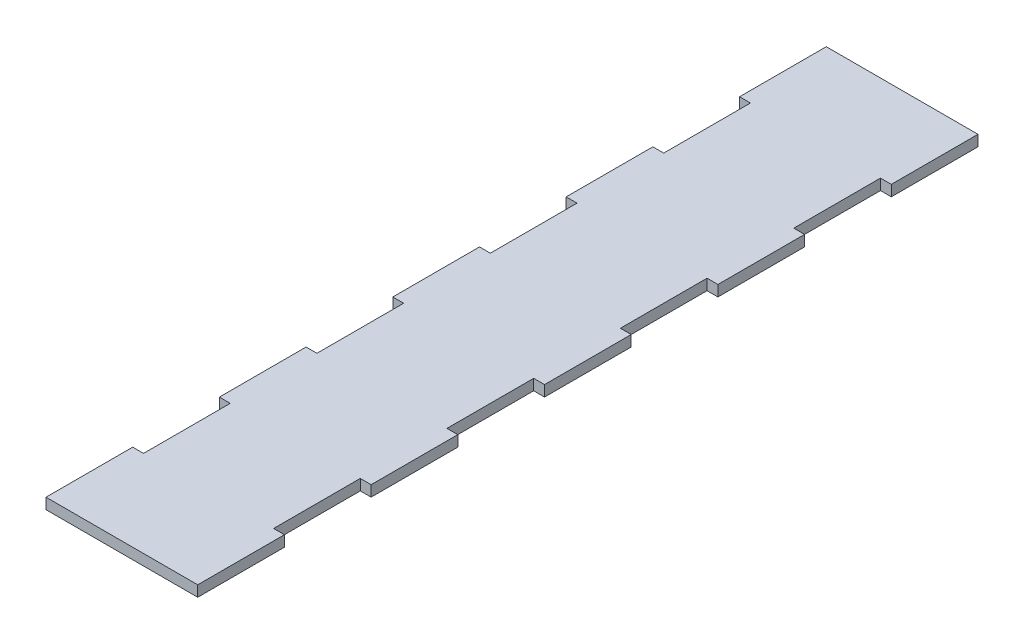
ISO-10303-21;
HEADER;
FILE_DESCRIPTION(('STEP AP214'),'2;1');
FILE_NAME('part.step','',(''),(''),'','','');
FILE_SCHEMA(('AUTOMOTIVE_DESIGN { 1 0 10303 214 1 1 1 1 }'));
ENDSEC;
DATA;
#1=APPLICATION_CONTEXT('core data for automotive mechanical design processes');
#2=APPLICATION_PROTOCOL_DEFINITION('international standard','automotive_design',2000,#1);
#3=PRODUCT_CONTEXT('',#1,'mechanical');
#4=PRODUCT('Part','Part','',(#3));
#5=PRODUCT_RELATED_PRODUCT_CATEGORY('part','',(#4));
#6=PRODUCT_DEFINITION_FORMATION('','',#4);
#7=PRODUCT_DEFINITION_CONTEXT('part definition',#1,'design');
#8=PRODUCT_DEFINITION('design','',#6,#7);
#9=PRODUCT_DEFINITION_SHAPE('','',#8);
#10=(LENGTH_UNIT() NAMED_UNIT(*) SI_UNIT(.MILLI.,.METRE.));
#11=(NAMED_UNIT(*) PLANE_ANGLE_UNIT() SI_UNIT($,.RADIAN.));
#12=(NAMED_UNIT(*) SI_UNIT($,.STERADIAN.) SOLID_ANGLE_UNIT());
#13=UNCERTAINTY_MEASURE_WITH_UNIT(LENGTH_MEASURE(1.E-05),#10,'distance_accuracy_value','');
#14=(GEOMETRIC_REPRESENTATION_CONTEXT(3) GLOBAL_UNCERTAINTY_ASSIGNED_CONTEXT((#13)) GLOBAL_UNIT_ASSIGNED_CONTEXT((#10,
#11,#12)) REPRESENTATION_CONTEXT('',''));
#15=CARTESIAN_POINT('',(0.,0.,0.));
#16=DIRECTION('',(0.,0.,1.));
#17=DIRECTION('',(1.,0.,0.));
#18=AXIS2_PLACEMENT_3D('',#15,#16,#17);
#19=CARTESIAN_POINT('',(38.1,0.,457.2));
#20=DIRECTION('',(-1.,0.,0.));
#21=DIRECTION('',(0.,0.,1.));
#22=AXIS2_PLACEMENT_3D('',#19,#20,#21);
#23=PLANE('',#22);
#24=DIRECTION('',(0.,1.,0.));
#25=VECTOR('',#24,1.);
#26=CARTESIAN_POINT('',(38.1,-13.0953367016958,50.8));
#27=LINE('',#26,#25);
#28=CARTESIAN_POINT('',(38.1,38.1,50.8));
#29=VERTEX_POINT('',#28);
#30=CARTESIAN_POINT('',(38.1,44.45,50.8));
#31=VERTEX_POINT('',#30);
#32=EDGE_CURVE('E56',#29,#31,#27,.T.);
#33=ORIENTED_EDGE('',*,*,#32,.T.);
#34=DIRECTION('',(0.,0.,-1.));
#35=VECTOR('',#34,1.);
#36=CARTESIAN_POINT('',(38.1,44.45,457.2));
#37=LINE('',#36,#35);
#38=CARTESIAN_POINT('',(38.1,44.45,101.6));
#39=VERTEX_POINT('',#38);
#40=EDGE_CURVE('E425',#39,#31,#37,.T.);
#41=ORIENTED_EDGE('',*,*,#40,.F.);
#42=DIRECTION('',(0.,1.,0.));
#43=VECTOR('',#42,1.);
#44=CARTESIAN_POINT('',(38.1,-13.0953367016958,101.6));
#45=LINE('',#44,#43);
#46=CARTESIAN_POINT('',(38.1,38.1,101.6));
#47=VERTEX_POINT('',#46);
#48=EDGE_CURVE('E294',#47,#39,#45,.T.);
#49=ORIENTED_EDGE('',*,*,#48,.F.);
#50=DIRECTION('',(0.,0.,-1.));
#51=VECTOR('',#50,1.);
#52=CARTESIAN_POINT('',(38.1,38.1,457.2));
#53=LINE('',#52,#51);
#54=EDGE_CURVE('E39',#47,#29,#53,.T.);
#55=ORIENTED_EDGE('',*,*,#54,.T.);
#56=EDGE_LOOP('',(#33,#41,#49,#55));
#57=FACE_BOUND('',#56,.T.);
#58=ADVANCED_FACE('F35',(#57),#23,.F.);
#59=DIRECTION('',(0.,1.,0.));
#60=VECTOR('',#59,1.);
#61=CARTESIAN_POINT('',(38.1,-13.0953367016958,152.4));
#62=LINE('',#61,#60);
#63=CARTESIAN_POINT('',(38.1,38.1,152.4));
#64=VERTEX_POINT('',#63);
#65=CARTESIAN_POINT('',(38.1,44.45,152.4));
#66=VERTEX_POINT('',#65);
#67=EDGE_CURVE('E291',#64,#66,#62,.T.);
#68=ORIENTED_EDGE('',*,*,#67,.T.);
#69=CARTESIAN_POINT('',(38.1,44.45,203.2));
#70=VERTEX_POINT('',#69);
#71=EDGE_CURVE('E411',#70,#66,#37,.T.);
#72=ORIENTED_EDGE('',*,*,#71,.F.);
#73=DIRECTION('',(0.,1.,0.));
#74=VECTOR('',#73,1.);
#75=CARTESIAN_POINT('',(38.1,-13.0953367016958,203.2));
#76=LINE('',#75,#74);
#77=CARTESIAN_POINT('',(38.1,38.1,203.2));
#78=VERTEX_POINT('',#77);
#79=EDGE_CURVE('E330',#78,#70,#76,.T.);
#80=ORIENTED_EDGE('',*,*,#79,.F.);
#81=EDGE_CURVE('E426',#78,#64,#53,.T.);
#82=ORIENTED_EDGE('',*,*,#81,.T.);
#83=EDGE_LOOP('',(#68,#72,#80,#82));
#84=FACE_BOUND('',#83,.T.);
#85=ADVANCED_FACE('F643',(#84),#23,.F.);
#86=DIRECTION('',(0.,1.,0.));
#87=VECTOR('',#86,1.);
#88=CARTESIAN_POINT('',(38.1,-13.0953367016958,254.));
#89=LINE('',#88,#87);
#90=CARTESIAN_POINT('',(38.1,38.1,254.));
#91=VERTEX_POINT('',#90);
#92=CARTESIAN_POINT('',(38.1,44.45,254.));
#93=VERTEX_POINT('',#92);
#94=EDGE_CURVE('E316',#91,#93,#89,.T.);
#95=ORIENTED_EDGE('',*,*,#94,.T.);
#96=CARTESIAN_POINT('',(38.1,44.45,304.8));
#97=VERTEX_POINT('',#96);
#98=EDGE_CURVE('E406',#97,#93,#37,.T.);
#99=ORIENTED_EDGE('',*,*,#98,.F.);
#100=DIRECTION('',(0.,1.,0.));
#101=VECTOR('',#100,1.);
#102=CARTESIAN_POINT('',(38.1,-13.0953367016958,304.8));
#103=LINE('',#102,#101);
#104=CARTESIAN_POINT('',(38.1,38.1,304.8));
#105=VERTEX_POINT('',#104);
#106=EDGE_CURVE('E357',#105,#97,#103,.T.);
#107=ORIENTED_EDGE('',*,*,#106,.F.);
#108=EDGE_CURVE('E45',#105,#91,#53,.T.);
#109=ORIENTED_EDGE('',*,*,#108,.T.);
#110=EDGE_LOOP('',(#95,#99,#107,#109));
#111=FACE_BOUND('',#110,.T.);
#112=ADVANCED_FACE('F648',(#111),#23,.F.);
#113=DIRECTION('',(0.,1.,0.));
#114=VECTOR('',#113,1.);
#115=CARTESIAN_POINT('',(38.1,-13.0953367016958,355.6));
#116=LINE('',#115,#114);
#117=CARTESIAN_POINT('',(38.1,38.1,355.6));
#118=VERTEX_POINT('',#117);
#119=CARTESIAN_POINT('',(38.1,44.45,355.6));
#120=VERTEX_POINT('',#119);
#121=EDGE_CURVE('E341',#118,#120,#116,.T.);
#122=ORIENTED_EDGE('',*,*,#121,.T.);
#123=CARTESIAN_POINT('',(38.1,44.45,406.4));
#124=VERTEX_POINT('',#123);
#125=EDGE_CURVE('E410',#124,#120,#37,.T.);
#126=ORIENTED_EDGE('',*,*,#125,.F.);
#127=DIRECTION('',(0.,1.,0.));
#128=VECTOR('',#127,1.);
#129=CARTESIAN_POINT('',(38.1,-13.0953367016958,406.4));
#130=LINE('',#129,#128);
#131=CARTESIAN_POINT('',(38.1,38.1,406.4));
#132=VERTEX_POINT('',#131);
#133=EDGE_CURVE('E368',#132,#124,#130,.T.);
#134=ORIENTED_EDGE('',*,*,#133,.F.);
#135=EDGE_CURVE('E11',#132,#118,#53,.T.);
#136=ORIENTED_EDGE('',*,*,#135,.T.);
#137=EDGE_LOOP('',(#122,#126,#134,#136));
#138=FACE_BOUND('',#137,.T.);
#139=ADVANCED_FACE('F644',(#138),#23,.F.);
#140=CARTESIAN_POINT('',(-38.1,0.,457.2));
#141=DIRECTION('',(-1.,0.,0.));
#142=DIRECTION('',(0.,0.,1.));
#143=AXIS2_PLACEMENT_3D('',#140,#141,#142);
#144=PLANE('',#143);
#145=DIRECTION('',(0.,1.,0.));
#146=VECTOR('',#145,1.);
#147=CARTESIAN_POINT('',(-38.1,-13.0953367016958,50.8));
#148=LINE('',#147,#146);
#149=CARTESIAN_POINT('',(-38.1,38.1,50.8));
#150=VERTEX_POINT('',#149);
#151=CARTESIAN_POINT('',(-38.1,44.45,50.8));
#152=VERTEX_POINT('',#151);
#153=EDGE_CURVE('E491',#150,#152,#148,.T.);
#154=ORIENTED_EDGE('',*,*,#153,.F.);
#155=DIRECTION('',(0.,0.,-1.));
#156=VECTOR('',#155,1.);
#157=CARTESIAN_POINT('',(-38.1,38.1,457.2));
#158=LINE('',#157,#156);
#159=CARTESIAN_POINT('',(-38.1,38.1,101.6));
#160=VERTEX_POINT('',#159);
#161=EDGE_CURVE('E463',#160,#150,#158,.T.);
#162=ORIENTED_EDGE('',*,*,#161,.F.);
#163=DIRECTION('',(0.,1.,0.));
#164=VECTOR('',#163,1.);
#165=CARTESIAN_POINT('',(-38.1,-13.0953367016958,101.6));
#166=LINE('',#165,#164);
#167=CARTESIAN_POINT('',(-38.1,44.45,101.6));
#168=VERTEX_POINT('',#167);
#169=EDGE_CURVE('E489',#160,#168,#166,.T.);
#170=ORIENTED_EDGE('',*,*,#169,.T.);
#171=DIRECTION('',(0.,0.,-1.));
#172=VECTOR('',#171,1.);
#173=CARTESIAN_POINT('',(-38.1,44.45,457.2));
#174=LINE('',#173,#172);
#175=EDGE_CURVE('E476',#168,#152,#174,.T.);
#176=ORIENTED_EDGE('',*,*,#175,.T.);
#177=EDGE_LOOP('',(#154,#162,#170,#176));
#178=FACE_BOUND('',#177,.T.);
#179=ADVANCED_FACE('F488',(#178),#144,.T.);
#180=DIRECTION('',(0.,1.,0.));
#181=VECTOR('',#180,1.);
#182=CARTESIAN_POINT('',(-38.1,-13.0953367016958,152.4));
#183=LINE('',#182,#181);
#184=CARTESIAN_POINT('',(-38.1,38.1,152.4));
#185=VERTEX_POINT('',#184);
#186=CARTESIAN_POINT('',(-38.1,44.45,152.4));
#187=VERTEX_POINT('',#186);
#188=EDGE_CURVE('E520',#185,#187,#183,.T.);
#189=ORIENTED_EDGE('',*,*,#188,.F.);
#190=CARTESIAN_POINT('',(-38.1,38.1,203.2));
#191=VERTEX_POINT('',#190);
#192=EDGE_CURVE('E473',#191,#185,#158,.T.);
#193=ORIENTED_EDGE('',*,*,#192,.F.);
#194=DIRECTION('',(0.,1.,0.));
#195=VECTOR('',#194,1.);
#196=CARTESIAN_POINT('',(-38.1,-13.0953367016958,203.2));
#197=LINE('',#196,#195);
#198=CARTESIAN_POINT('',(-38.1,44.45,203.2));
#199=VERTEX_POINT('',#198);
#200=EDGE_CURVE('E553',#191,#199,#197,.T.);
#201=ORIENTED_EDGE('',*,*,#200,.T.);
#202=EDGE_CURVE('E436',#199,#187,#174,.T.);
#203=ORIENTED_EDGE('',*,*,#202,.T.);
#204=EDGE_LOOP('',(#189,#193,#201,#203));
#205=FACE_BOUND('',#204,.T.);
#206=ADVANCED_FACE('F623',(#205),#144,.T.);
#207=DIRECTION('',(0.,1.,0.));
#208=VECTOR('',#207,1.);
#209=CARTESIAN_POINT('',(-38.1,-13.0953367016958,254.));
#210=LINE('',#209,#208);
#211=CARTESIAN_POINT('',(-38.1,38.1,254.));
#212=VERTEX_POINT('',#211);
#213=CARTESIAN_POINT('',(-38.1,44.45,254.));
#214=VERTEX_POINT('',#213);
#215=EDGE_CURVE('E546',#212,#214,#210,.T.);
#216=ORIENTED_EDGE('',*,*,#215,.F.);
#217=CARTESIAN_POINT('',(-38.1,38.1,304.8));
#218=VERTEX_POINT('',#217);
#219=EDGE_CURVE('E470',#218,#212,#158,.T.);
#220=ORIENTED_EDGE('',*,*,#219,.F.);
#221=DIRECTION('',(0.,1.,0.));
#222=VECTOR('',#221,1.);
#223=CARTESIAN_POINT('',(-38.1,-13.0953367016958,304.8));
#224=LINE('',#223,#222);
#225=CARTESIAN_POINT('',(-38.1,44.45,304.8));
#226=VERTEX_POINT('',#225);
#227=EDGE_CURVE('E444',#218,#226,#224,.T.);
#228=ORIENTED_EDGE('',*,*,#227,.T.);
#229=EDGE_CURVE('E430',#226,#214,#174,.T.);
#230=ORIENTED_EDGE('',*,*,#229,.T.);
#231=EDGE_LOOP('',(#216,#220,#228,#230));
#232=FACE_BOUND('',#231,.T.);
#233=ADVANCED_FACE('F932',(#232),#144,.T.);
#234=DIRECTION('',(0.,1.,0.));
#235=VECTOR('',#234,1.);
#236=CARTESIAN_POINT('',(-38.1,-13.0953367016958,355.6));
#237=LINE('',#236,#235);
#238=CARTESIAN_POINT('',(-38.1,38.1,355.6));
#239=VERTEX_POINT('',#238);
#240=CARTESIAN_POINT('',(-38.1,44.45,355.6));
#241=VERTEX_POINT('',#240);
#242=EDGE_CURVE('E574',#239,#241,#237,.T.);
#243=ORIENTED_EDGE('',*,*,#242,.F.);
#244=CARTESIAN_POINT('',(-38.1,38.1,406.4));
#245=VERTEX_POINT('',#244);
#246=EDGE_CURVE('E439',#245,#239,#158,.T.);
#247=ORIENTED_EDGE('',*,*,#246,.F.);
#248=DIRECTION('',(0.,1.,0.));
#249=VECTOR('',#248,1.);
#250=CARTESIAN_POINT('',(-38.1,-13.0953367016958,406.4));
#251=LINE('',#250,#249);
#252=CARTESIAN_POINT('',(-38.1,44.45,406.4));
#253=VERTEX_POINT('',#252);
#254=EDGE_CURVE('E447',#245,#253,#251,.T.);
#255=ORIENTED_EDGE('',*,*,#254,.T.);
#256=EDGE_CURVE('E428',#253,#241,#174,.T.);
#257=ORIENTED_EDGE('',*,*,#256,.T.);
#258=EDGE_LOOP('',(#243,#247,#255,#257));
#259=FACE_BOUND('',#258,.T.);
#260=ADVANCED_FACE('F603',(#259),#144,.T.);
#261=CARTESIAN_POINT('',(0.,38.1,457.2));
#262=DIRECTION('',(0.,-1.,0.));
#263=DIRECTION('',(1.,0.,0.));
#264=AXIS2_PLACEMENT_3D('',#261,#262,#263);
#265=PLANE('',#264);
#266=DIRECTION('',(-1.,0.,0.));
#267=VECTOR('',#266,1.);
#268=CARTESIAN_POINT('',(0.,38.1,0.));
#269=LINE('',#268,#267);
#270=CARTESIAN_POINT('',(44.45,38.1,0.));
#271=VERTEX_POINT('',#270);
#272=CARTESIAN_POINT('',(-44.45,38.1,0.));
#273=VERTEX_POINT('',#272);
#274=EDGE_CURVE('E290',#271,#273,#269,.T.);
#275=ORIENTED_EDGE('',*,*,#274,.F.);
#276=DIRECTION('',(0.,0.,1.));
#277=VECTOR('',#276,1.);
#278=CARTESIAN_POINT('',(44.45,38.1,50.8));
#279=LINE('',#278,#277);
#280=CARTESIAN_POINT('',(44.45,38.1,50.8));
#281=VERTEX_POINT('',#280);
#282=EDGE_CURVE('E275',#271,#281,#279,.T.);
#283=ORIENTED_EDGE('',*,*,#282,.T.);
#284=DIRECTION('',(-1.,0.,0.));
#285=VECTOR('',#284,1.);
#286=CARTESIAN_POINT('',(38.1,38.1,50.8));
#287=LINE('',#286,#285);
#288=EDGE_CURVE('E285',#281,#29,#287,.T.);
#289=ORIENTED_EDGE('',*,*,#288,.T.);
#290=ORIENTED_EDGE('',*,*,#54,.F.);
#291=DIRECTION('',(1.,0.,0.));
#292=VECTOR('',#291,1.);
#293=CARTESIAN_POINT('',(38.1,38.1,101.6));
#294=LINE('',#293,#292);
#295=CARTESIAN_POINT('',(44.45,38.1,101.6));
#296=VERTEX_POINT('',#295);
#297=EDGE_CURVE('E317',#47,#296,#294,.T.);
#298=ORIENTED_EDGE('',*,*,#297,.T.);
#299=DIRECTION('',(0.,0.,1.));
#300=VECTOR('',#299,1.);
#301=CARTESIAN_POINT('',(44.45,38.1,152.4));
#302=LINE('',#301,#300);
#303=CARTESIAN_POINT('',(44.45,38.1,152.4));
#304=VERTEX_POINT('',#303);
#305=EDGE_CURVE('E313',#296,#304,#302,.T.);
#306=ORIENTED_EDGE('',*,*,#305,.T.);
#307=DIRECTION('',(-1.,0.,0.));
#308=VECTOR('',#307,1.);
#309=CARTESIAN_POINT('',(38.1,38.1,152.4));
#310=LINE('',#309,#308);
#311=EDGE_CURVE('E312',#304,#64,#310,.T.);
#312=ORIENTED_EDGE('',*,*,#311,.T.);
#313=ORIENTED_EDGE('',*,*,#81,.F.);
#314=DIRECTION('',(1.,0.,0.));
#315=VECTOR('',#314,1.);
#316=CARTESIAN_POINT('',(38.1,38.1,203.2));
#317=LINE('',#316,#315);
#318=CARTESIAN_POINT('',(44.45,38.1,203.2));
#319=VERTEX_POINT('',#318);
#320=EDGE_CURVE('E342',#78,#319,#317,.T.);
#321=ORIENTED_EDGE('',*,*,#320,.T.);
#322=DIRECTION('',(0.,0.,1.));
#323=VECTOR('',#322,1.);
#324=CARTESIAN_POINT('',(44.45,38.1,254.));
#325=LINE('',#324,#323);
#326=CARTESIAN_POINT('',(44.45,38.1,254.));
#327=VERTEX_POINT('',#326);
#328=EDGE_CURVE('E338',#319,#327,#325,.T.);
#329=ORIENTED_EDGE('',*,*,#328,.T.);
#330=DIRECTION('',(-1.,0.,0.));
#331=VECTOR('',#330,1.);
#332=CARTESIAN_POINT('',(38.1,38.1,254.));
#333=LINE('',#332,#331);
#334=EDGE_CURVE('E337',#327,#91,#333,.T.);
#335=ORIENTED_EDGE('',*,*,#334,.T.);
#336=ORIENTED_EDGE('',*,*,#108,.F.);
#337=DIRECTION('',(1.,0.,0.));
#338=VECTOR('',#337,1.);
#339=CARTESIAN_POINT('',(38.1,38.1,304.8));
#340=LINE('',#339,#338);
#341=CARTESIAN_POINT('',(44.45,38.1,304.8));
#342=VERTEX_POINT('',#341);
#343=EDGE_CURVE('E369',#105,#342,#340,.T.);
#344=ORIENTED_EDGE('',*,*,#343,.T.);
#345=DIRECTION('',(0.,0.,1.));
#346=VECTOR('',#345,1.);
#347=CARTESIAN_POINT('',(44.45,38.1,355.6));
#348=LINE('',#347,#346);
#349=CARTESIAN_POINT('',(44.45,38.1,355.6));
#350=VERTEX_POINT('',#349);
#351=EDGE_CURVE('E365',#342,#350,#348,.T.);
#352=ORIENTED_EDGE('',*,*,#351,.T.);
#353=DIRECTION('',(-1.,0.,0.));
#354=VECTOR('',#353,1.);
#355=CARTESIAN_POINT('',(38.1,38.1,355.6));
#356=LINE('',#355,#354);
#357=EDGE_CURVE('E364',#350,#118,#356,.T.);
#358=ORIENTED_EDGE('',*,*,#357,.T.);
#359=ORIENTED_EDGE('',*,*,#135,.F.);
#360=DIRECTION('',(1.,0.,0.));
#361=VECTOR('',#360,1.);
#362=CARTESIAN_POINT('',(38.1,38.1,406.4));
#363=LINE('',#362,#361);
#364=CARTESIAN_POINT('',(44.45,38.1,406.4));
#365=VERTEX_POINT('',#364);
#366=EDGE_CURVE('E389',#132,#365,#363,.T.);
#367=ORIENTED_EDGE('',*,*,#366,.T.);
#368=DIRECTION('',(0.,0.,1.));
#369=VECTOR('',#368,1.);
#370=CARTESIAN_POINT('',(44.45,38.1,457.2));
#371=LINE('',#370,#369);
#372=CARTESIAN_POINT('',(44.45,38.1,457.2));
#373=VERTEX_POINT('',#372);
#374=EDGE_CURVE('E385',#365,#373,#371,.T.);
#375=ORIENTED_EDGE('',*,*,#374,.T.);
#376=DIRECTION('',(-1.,0.,0.));
#377=VECTOR('',#376,1.);
#378=CARTESIAN_POINT('',(0.,38.1,457.2));
#379=LINE('',#378,#377);
#380=CARTESIAN_POINT('',(-44.45,38.1,457.2));
#381=VERTEX_POINT('',#380);
#382=EDGE_CURVE('E458',#373,#381,#379,.T.);
#383=ORIENTED_EDGE('',*,*,#382,.T.);
#384=DIRECTION('',(0.,0.,1.));
#385=VECTOR('',#384,1.);
#386=CARTESIAN_POINT('',(-44.45,38.1,457.2));
#387=LINE('',#386,#385);
#388=CARTESIAN_POINT('',(-44.45,38.1,406.4));
#389=VERTEX_POINT('',#388);
#390=EDGE_CURVE('E586',#389,#381,#387,.T.);
#391=ORIENTED_EDGE('',*,*,#390,.F.);
#392=DIRECTION('',(-1.,0.,0.));
#393=VECTOR('',#392,1.);
#394=CARTESIAN_POINT('',(-38.1,38.1,406.4));
#395=LINE('',#394,#393);
#396=EDGE_CURVE('E451',#245,#389,#395,.T.);
#397=ORIENTED_EDGE('',*,*,#396,.F.);
#398=ORIENTED_EDGE('',*,*,#246,.T.);
#399=DIRECTION('',(1.,0.,0.));
#400=VECTOR('',#399,1.);
#401=CARTESIAN_POINT('',(-38.1,38.1,355.6));
#402=LINE('',#401,#400);
#403=CARTESIAN_POINT('',(-44.45,38.1,355.6));
#404=VERTEX_POINT('',#403);
#405=EDGE_CURVE('E571',#404,#239,#402,.T.);
#406=ORIENTED_EDGE('',*,*,#405,.F.);
#407=DIRECTION('',(0.,0.,1.));
#408=VECTOR('',#407,1.);
#409=CARTESIAN_POINT('',(-44.45,38.1,355.6));
#410=LINE('',#409,#408);
#411=CARTESIAN_POINT('',(-44.45,38.1,304.8));
#412=VERTEX_POINT('',#411);
#413=EDGE_CURVE('E576',#412,#404,#410,.T.);
#414=ORIENTED_EDGE('',*,*,#413,.F.);
#415=DIRECTION('',(-1.,0.,0.));
#416=VECTOR('',#415,1.);
#417=CARTESIAN_POINT('',(-38.1,38.1,304.8));
#418=LINE('',#417,#416);
#419=EDGE_CURVE('E562',#218,#412,#418,.T.);
#420=ORIENTED_EDGE('',*,*,#419,.F.);
#421=ORIENTED_EDGE('',*,*,#219,.T.);
#422=DIRECTION('',(1.,0.,0.));
#423=VECTOR('',#422,1.);
#424=CARTESIAN_POINT('',(-38.1,38.1,254.));
#425=LINE('',#424,#423);
#426=CARTESIAN_POINT('',(-44.45,38.1,254.));
#427=VERTEX_POINT('',#426);
#428=EDGE_CURVE('E543',#427,#212,#425,.T.);
#429=ORIENTED_EDGE('',*,*,#428,.F.);
#430=DIRECTION('',(0.,0.,1.));
#431=VECTOR('',#430,1.);
#432=CARTESIAN_POINT('',(-44.45,38.1,254.));
#433=LINE('',#432,#431);
#434=CARTESIAN_POINT('',(-44.45,38.1,203.2));
#435=VERTEX_POINT('',#434);
#436=EDGE_CURVE('E548',#435,#427,#433,.T.);
#437=ORIENTED_EDGE('',*,*,#436,.F.);
#438=DIRECTION('',(-1.,0.,0.));
#439=VECTOR('',#438,1.);
#440=CARTESIAN_POINT('',(-38.1,38.1,203.2));
#441=LINE('',#440,#439);
#442=EDGE_CURVE('E534',#191,#435,#441,.T.);
#443=ORIENTED_EDGE('',*,*,#442,.F.);
#444=ORIENTED_EDGE('',*,*,#192,.T.);
#445=DIRECTION('',(1.,0.,0.));
#446=VECTOR('',#445,1.);
#447=CARTESIAN_POINT('',(-38.1,38.1,152.4));
#448=LINE('',#447,#446);
#449=CARTESIAN_POINT('',(-44.45,38.1,152.4));
#450=VERTEX_POINT('',#449);
#451=EDGE_CURVE('E517',#450,#185,#448,.T.);
#452=ORIENTED_EDGE('',*,*,#451,.F.);
#453=DIRECTION('',(0.,0.,1.));
#454=VECTOR('',#453,1.);
#455=CARTESIAN_POINT('',(-44.45,38.1,152.4));
#456=LINE('',#455,#454);
#457=CARTESIAN_POINT('',(-44.45,38.1,101.6));
#458=VERTEX_POINT('',#457);
#459=EDGE_CURVE('E522',#458,#450,#456,.T.);
#460=ORIENTED_EDGE('',*,*,#459,.F.);
#461=DIRECTION('',(-1.,0.,0.));
#462=VECTOR('',#461,1.);
#463=CARTESIAN_POINT('',(-38.1,38.1,101.6));
#464=LINE('',#463,#462);
#465=EDGE_CURVE('E483',#160,#458,#464,.T.);
#466=ORIENTED_EDGE('',*,*,#465,.F.);
#467=ORIENTED_EDGE('',*,*,#161,.T.);
#468=DIRECTION('',(1.,0.,0.));
#469=VECTOR('',#468,1.);
#470=CARTESIAN_POINT('',(-38.1,38.1,50.8));
#471=LINE('',#470,#469);
#472=CARTESIAN_POINT('',(-44.45,38.1,50.8));
#473=VERTEX_POINT('',#472);
#474=EDGE_CURVE('E480',#473,#150,#471,.T.);
#475=ORIENTED_EDGE('',*,*,#474,.F.);
#476=DIRECTION('',(0.,0.,1.));
#477=VECTOR('',#476,1.);
#478=CARTESIAN_POINT('',(-44.45,38.1,50.8));
#479=LINE('',#478,#477);
#480=EDGE_CURVE('E504',#273,#473,#479,.T.);
#481=ORIENTED_EDGE('',*,*,#480,.F.);
#482=EDGE_LOOP('',(#275,#283,#289,#290,#298,#306,#312,#313,#321,#329,#335,#336,#344,#352,#358,
#359,#367,#375,#383,#391,#397,#398,#406,#414,#420,#421,#429,#437,#443,#444,#452,#460,#466,#467,
#475,#481));
#483=FACE_BOUND('',#482,.T.);
#484=ADVANCED_FACE('F37',(#483),#265,.T.);
#485=CARTESIAN_POINT('',(0.,44.45,457.2));
#486=DIRECTION('',(0.,1.,0.));
#487=DIRECTION('',(0.,0.,1.));
#488=AXIS2_PLACEMENT_3D('',#485,#486,#487);
#489=PLANE('',#488);
#490=DIRECTION('',(1.,0.,0.));
#491=VECTOR('',#490,1.);
#492=CARTESIAN_POINT('',(0.,44.45,0.));
#493=LINE('',#492,#491);
#494=CARTESIAN_POINT('',(-44.45,44.45,0.));
#495=VERTEX_POINT('',#494);
#496=CARTESIAN_POINT('',(44.45,44.45,0.));
#497=VERTEX_POINT('',#496);
#498=EDGE_CURVE('E461',#495,#497,#493,.T.);
#499=ORIENTED_EDGE('',*,*,#498,.F.);
#500=DIRECTION('',(0.,0.,1.));
#501=VECTOR('',#500,1.);
#502=CARTESIAN_POINT('',(-44.45,44.45,50.8));
#503=LINE('',#502,#501);
#504=CARTESIAN_POINT('',(-44.45,44.45,50.8));
#505=VERTEX_POINT('',#504);
#506=EDGE_CURVE('E388',#495,#505,#503,.T.);
#507=ORIENTED_EDGE('',*,*,#506,.T.);
#508=DIRECTION('',(1.,0.,0.));
#509=VECTOR('',#508,1.);
#510=CARTESIAN_POINT('',(-38.1,44.45,50.8));
#511=LINE('',#510,#509);
#512=EDGE_CURVE('E509',#505,#152,#511,.T.);
#513=ORIENTED_EDGE('',*,*,#512,.T.);
#514=ORIENTED_EDGE('',*,*,#175,.F.);
#515=DIRECTION('',(-1.,0.,0.));
#516=VECTOR('',#515,1.);
#517=CARTESIAN_POINT('',(-38.1,44.45,101.6));
#518=LINE('',#517,#516);
#519=CARTESIAN_POINT('',(-44.45,44.45,101.6));
#520=VERTEX_POINT('',#519);
#521=EDGE_CURVE('E495',#168,#520,#518,.T.);
#522=ORIENTED_EDGE('',*,*,#521,.T.);
#523=DIRECTION('',(0.,0.,1.));
#524=VECTOR('',#523,1.);
#525=CARTESIAN_POINT('',(-44.45,44.45,152.4));
#526=LINE('',#525,#524);
#527=CARTESIAN_POINT('',(-44.45,44.45,152.4));
#528=VERTEX_POINT('',#527);
#529=EDGE_CURVE('E498',#520,#528,#526,.T.);
#530=ORIENTED_EDGE('',*,*,#529,.T.);
#531=DIRECTION('',(1.,0.,0.));
#532=VECTOR('',#531,1.);
#533=CARTESIAN_POINT('',(-38.1,44.45,152.4));
#534=LINE('',#533,#532);
#535=EDGE_CURVE('E510',#528,#187,#534,.T.);
#536=ORIENTED_EDGE('',*,*,#535,.T.);
#537=ORIENTED_EDGE('',*,*,#202,.F.);
#538=DIRECTION('',(-1.,0.,0.));
#539=VECTOR('',#538,1.);
#540=CARTESIAN_POINT('',(-38.1,44.45,203.2));
#541=LINE('',#540,#539);
#542=CARTESIAN_POINT('',(-44.45,44.45,203.2));
#543=VERTEX_POINT('',#542);
#544=EDGE_CURVE('E530',#199,#543,#541,.T.);
#545=ORIENTED_EDGE('',*,*,#544,.T.);
#546=DIRECTION('',(0.,0.,1.));
#547=VECTOR('',#546,1.);
#548=CARTESIAN_POINT('',(-44.45,44.45,254.));
#549=LINE('',#548,#547);
#550=CARTESIAN_POINT('',(-44.45,44.45,254.));
#551=VERTEX_POINT('',#550);
#552=EDGE_CURVE('E535',#543,#551,#549,.T.);
#553=ORIENTED_EDGE('',*,*,#552,.T.);
#554=DIRECTION('',(1.,0.,0.));
#555=VECTOR('',#554,1.);
#556=CARTESIAN_POINT('',(-38.1,44.45,254.));
#557=LINE('',#556,#555);
#558=EDGE_CURVE('E531',#551,#214,#557,.T.);
#559=ORIENTED_EDGE('',*,*,#558,.T.);
#560=ORIENTED_EDGE('',*,*,#229,.F.);
#561=DIRECTION('',(-1.,0.,0.));
#562=VECTOR('',#561,1.);
#563=CARTESIAN_POINT('',(-38.1,44.45,304.8));
#564=LINE('',#563,#562);
#565=CARTESIAN_POINT('',(-44.45,44.45,304.8));
#566=VERTEX_POINT('',#565);
#567=EDGE_CURVE('E558',#226,#566,#564,.T.);
#568=ORIENTED_EDGE('',*,*,#567,.T.);
#569=DIRECTION('',(0.,0.,1.));
#570=VECTOR('',#569,1.);
#571=CARTESIAN_POINT('',(-44.45,44.45,355.6));
#572=LINE('',#571,#570);
#573=CARTESIAN_POINT('',(-44.45,44.45,355.6));
#574=VERTEX_POINT('',#573);
#575=EDGE_CURVE('E563',#566,#574,#572,.T.);
#576=ORIENTED_EDGE('',*,*,#575,.T.);
#577=DIRECTION('',(1.,0.,0.));
#578=VECTOR('',#577,1.);
#579=CARTESIAN_POINT('',(-38.1,44.45,355.6));
#580=LINE('',#579,#578);
#581=EDGE_CURVE('E559',#574,#241,#580,.T.);
#582=ORIENTED_EDGE('',*,*,#581,.T.);
#583=ORIENTED_EDGE('',*,*,#256,.F.);
#584=DIRECTION('',(-1.,0.,0.));
#585=VECTOR('',#584,1.);
#586=CARTESIAN_POINT('',(-38.1,44.45,406.4));
#587=LINE('',#586,#585);
#588=CARTESIAN_POINT('',(-44.45,44.45,406.4));
#589=VERTEX_POINT('',#588);
#590=EDGE_CURVE('E440',#253,#589,#587,.T.);
#591=ORIENTED_EDGE('',*,*,#590,.T.);
#592=DIRECTION('',(0.,0.,1.));
#593=VECTOR('',#592,1.);
#594=CARTESIAN_POINT('',(-44.45,44.45,457.2));
#595=LINE('',#594,#593);
#596=CARTESIAN_POINT('',(-44.45,44.45,457.2));
#597=VERTEX_POINT('',#596);
#598=EDGE_CURVE('E443',#589,#597,#595,.T.);
#599=ORIENTED_EDGE('',*,*,#598,.T.);
#600=DIRECTION('',(1.,0.,0.));
#601=VECTOR('',#600,1.);
#602=CARTESIAN_POINT('',(0.,44.45,457.2));
#603=LINE('',#602,#601);
#604=CARTESIAN_POINT('',(44.45,44.45,457.2));
#605=VERTEX_POINT('',#604);
#606=EDGE_CURVE('E460',#597,#605,#603,.T.);
#607=ORIENTED_EDGE('',*,*,#606,.T.);
#608=DIRECTION('',(0.,0.,1.));
#609=VECTOR('',#608,1.);
#610=CARTESIAN_POINT('',(44.45,44.45,457.2));
#611=LINE('',#610,#609);
#612=CARTESIAN_POINT('',(44.45,44.45,406.4));
#613=VERTEX_POINT('',#612);
#614=EDGE_CURVE('E380',#613,#605,#611,.T.);
#615=ORIENTED_EDGE('',*,*,#614,.F.);
#616=DIRECTION('',(1.,0.,0.));
#617=VECTOR('',#616,1.);
#618=CARTESIAN_POINT('',(38.1,44.45,406.4));
#619=LINE('',#618,#617);
#620=EDGE_CURVE('E396',#124,#613,#619,.T.);
#621=ORIENTED_EDGE('',*,*,#620,.F.);
#622=ORIENTED_EDGE('',*,*,#125,.T.);
#623=DIRECTION('',(-1.,0.,0.));
#624=VECTOR('',#623,1.);
#625=CARTESIAN_POINT('',(38.1,44.45,355.6));
#626=LINE('',#625,#624);
#627=CARTESIAN_POINT('',(44.45,44.45,355.6));
#628=VERTEX_POINT('',#627);
#629=EDGE_CURVE('E362',#628,#120,#626,.T.);
#630=ORIENTED_EDGE('',*,*,#629,.F.);
#631=DIRECTION('',(0.,0.,1.));
#632=VECTOR('',#631,1.);
#633=CARTESIAN_POINT('',(44.45,44.45,355.6));
#634=LINE('',#633,#632);
#635=CARTESIAN_POINT('',(44.45,44.45,304.8));
#636=VERTEX_POINT('',#635);
#637=EDGE_CURVE('E358',#636,#628,#634,.T.);
#638=ORIENTED_EDGE('',*,*,#637,.F.);
#639=DIRECTION('',(1.,0.,0.));
#640=VECTOR('',#639,1.);
#641=CARTESIAN_POINT('',(38.1,44.45,304.8));
#642=LINE('',#641,#640);
#643=EDGE_CURVE('E353',#97,#636,#642,.T.);
#644=ORIENTED_EDGE('',*,*,#643,.F.);
#645=ORIENTED_EDGE('',*,*,#98,.T.);
#646=DIRECTION('',(-1.,0.,0.));
#647=VECTOR('',#646,1.);
#648=CARTESIAN_POINT('',(38.1,44.45,254.));
#649=LINE('',#648,#647);
#650=CARTESIAN_POINT('',(44.45,44.45,254.));
#651=VERTEX_POINT('',#650);
#652=EDGE_CURVE('E335',#651,#93,#649,.T.);
#653=ORIENTED_EDGE('',*,*,#652,.F.);
#654=DIRECTION('',(0.,0.,1.));
#655=VECTOR('',#654,1.);
#656=CARTESIAN_POINT('',(44.45,44.45,254.));
#657=LINE('',#656,#655);
#658=CARTESIAN_POINT('',(44.45,44.45,203.2));
#659=VERTEX_POINT('',#658);
#660=EDGE_CURVE('E331',#659,#651,#657,.T.);
#661=ORIENTED_EDGE('',*,*,#660,.F.);
#662=DIRECTION('',(1.,0.,0.));
#663=VECTOR('',#662,1.);
#664=CARTESIAN_POINT('',(38.1,44.45,203.2));
#665=LINE('',#664,#663);
#666=EDGE_CURVE('E326',#70,#659,#665,.T.);
#667=ORIENTED_EDGE('',*,*,#666,.F.);
#668=ORIENTED_EDGE('',*,*,#71,.T.);
#669=DIRECTION('',(-1.,0.,0.));
#670=VECTOR('',#669,1.);
#671=CARTESIAN_POINT('',(38.1,44.45,152.4));
#672=LINE('',#671,#670);
#673=CARTESIAN_POINT('',(44.45,44.45,152.4));
#674=VERTEX_POINT('',#673);
#675=EDGE_CURVE('E310',#674,#66,#672,.T.);
#676=ORIENTED_EDGE('',*,*,#675,.F.);
#677=DIRECTION('',(0.,0.,1.));
#678=VECTOR('',#677,1.);
#679=CARTESIAN_POINT('',(44.45,44.45,152.4));
#680=LINE('',#679,#678);
#681=CARTESIAN_POINT('',(44.45,44.45,101.6));
#682=VERTEX_POINT('',#681);
#683=EDGE_CURVE('E306',#682,#674,#680,.T.);
#684=ORIENTED_EDGE('',*,*,#683,.F.);
#685=DIRECTION('',(1.,0.,0.));
#686=VECTOR('',#685,1.);
#687=CARTESIAN_POINT('',(38.1,44.45,101.6));
#688=LINE('',#687,#686);
#689=EDGE_CURVE('E302',#39,#682,#688,.T.);
#690=ORIENTED_EDGE('',*,*,#689,.F.);
#691=ORIENTED_EDGE('',*,*,#40,.T.);
#692=DIRECTION('',(-1.,0.,0.));
#693=VECTOR('',#692,1.);
#694=CARTESIAN_POINT('',(38.1,44.45,50.8));
#695=LINE('',#694,#693);
#696=CARTESIAN_POINT('',(44.45,44.45,50.8));
#697=VERTEX_POINT('',#696);
#698=EDGE_CURVE('E282',#697,#31,#695,.T.);
#699=ORIENTED_EDGE('',*,*,#698,.F.);
#700=DIRECTION('',(0.,0.,1.));
#701=VECTOR('',#700,1.);
#702=CARTESIAN_POINT('',(44.45,44.45,50.8));
#703=LINE('',#702,#701);
#704=EDGE_CURVE('E278',#497,#697,#703,.T.);
#705=ORIENTED_EDGE('',*,*,#704,.F.);
#706=EDGE_LOOP('',(#499,#507,#513,#514,#522,#530,#536,#537,#545,#553,#559,#560,#568,#576,#582,
#583,#591,#599,#607,#615,#621,#622,#630,#638,#644,#645,#653,#661,#667,#668,#676,#684,#690,#691,
#699,#705));
#707=FACE_BOUND('',#706,.T.);
#708=ADVANCED_FACE('F595',(#707),#489,.T.);
#709=CARTESIAN_POINT('',(0.,0.,457.2));
#710=DIRECTION('',(0.,0.,1.));
#711=DIRECTION('',(1.,0.,0.));
#712=AXIS2_PLACEMENT_3D('',#709,#710,#711);
#713=PLANE('',#712);
#714=ORIENTED_EDGE('',*,*,#382,.F.);
#715=DIRECTION('',(0.,1.,0.));
#716=VECTOR('',#715,1.);
#717=CARTESIAN_POINT('',(44.45,-13.0953367016958,457.2));
#718=LINE('',#717,#716);
#719=EDGE_CURVE('E383',#373,#605,#718,.T.);
#720=ORIENTED_EDGE('',*,*,#719,.T.);
#721=ORIENTED_EDGE('',*,*,#606,.F.);
#722=DIRECTION('',(0.,1.,0.));
#723=VECTOR('',#722,1.);
#724=CARTESIAN_POINT('',(-44.45,-13.0953367016958,457.2));
#725=LINE('',#724,#723);
#726=EDGE_CURVE('E450',#381,#597,#725,.T.);
#727=ORIENTED_EDGE('',*,*,#726,.F.);
#728=EDGE_LOOP('',(#714,#720,#721,#727));
#729=FACE_BOUND('',#728,.T.);
#730=ADVANCED_FACE('F840',(#729),#713,.T.);
#731=CARTESIAN_POINT('',(0.,0.,0.));
#732=DIRECTION('',(0.,0.,1.));
#733=DIRECTION('',(1.,0.,0.));
#734=AXIS2_PLACEMENT_3D('',#731,#732,#733);
#735=PLANE('',#734);
#736=ORIENTED_EDGE('',*,*,#274,.T.);
#737=DIRECTION('',(0.,1.,0.));
#738=VECTOR('',#737,1.);
#739=CARTESIAN_POINT('',(-44.45,-13.0953367016958,0.));
#740=LINE('',#739,#738);
#741=EDGE_CURVE('E506',#273,#495,#740,.T.);
#742=ORIENTED_EDGE('',*,*,#741,.T.);
#743=ORIENTED_EDGE('',*,*,#498,.T.);
#744=DIRECTION('',(0.,1.,0.));
#745=VECTOR('',#744,1.);
#746=CARTESIAN_POINT('',(44.45,-13.0953367016958,0.));
#747=LINE('',#746,#745);
#748=EDGE_CURVE('E299',#271,#497,#747,.T.);
#749=ORIENTED_EDGE('',*,*,#748,.F.);
#750=EDGE_LOOP('',(#736,#742,#743,#749));
#751=FACE_BOUND('',#750,.T.);
#752=ADVANCED_FACE('F834',(#751),#735,.F.);
#753=CARTESIAN_POINT('',(-38.1,-13.0953367016958,406.4));
#754=DIRECTION('',(0.,0.,-1.));
#755=DIRECTION('',(-1.,0.,0.));
#756=AXIS2_PLACEMENT_3D('',#753,#754,#755);
#757=PLANE('',#756);
#758=ORIENTED_EDGE('',*,*,#254,.F.);
#759=ORIENTED_EDGE('',*,*,#396,.T.);
#760=DIRECTION('',(0.,1.,0.));
#761=VECTOR('',#760,1.);
#762=CARTESIAN_POINT('',(-44.45,-13.0953367016958,406.4));
#763=LINE('',#762,#761);
#764=EDGE_CURVE('E456',#389,#589,#763,.T.);
#765=ORIENTED_EDGE('',*,*,#764,.T.);
#766=ORIENTED_EDGE('',*,*,#590,.F.);
#767=EDGE_LOOP('',(#758,#759,#765,#766));
#768=FACE_BOUND('',#767,.T.);
#769=ADVANCED_FACE('F600',(#768),#757,.T.);
#770=CARTESIAN_POINT('',(-44.45,-13.0953367016958,457.2));
#771=DIRECTION('',(-1.,0.,0.));
#772=DIRECTION('',(0.,0.,1.));
#773=AXIS2_PLACEMENT_3D('',#770,#771,#772);
#774=PLANE('',#773);
#775=ORIENTED_EDGE('',*,*,#764,.F.);
#776=ORIENTED_EDGE('',*,*,#390,.T.);
#777=ORIENTED_EDGE('',*,*,#726,.T.);
#778=ORIENTED_EDGE('',*,*,#598,.F.);
#779=EDGE_LOOP('',(#775,#776,#777,#778));
#780=FACE_BOUND('',#779,.T.);
#781=ADVANCED_FACE('F593',(#780),#774,.T.);
#782=CARTESIAN_POINT('',(-38.1,-13.0953367016958,304.8));
#783=DIRECTION('',(0.,0.,-1.));
#784=DIRECTION('',(-1.,0.,0.));
#785=AXIS2_PLACEMENT_3D('',#782,#783,#784);
#786=PLANE('',#785);
#787=ORIENTED_EDGE('',*,*,#227,.F.);
#788=ORIENTED_EDGE('',*,*,#419,.T.);
#789=DIRECTION('',(0.,1.,0.));
#790=VECTOR('',#789,1.);
#791=CARTESIAN_POINT('',(-44.45,-13.0953367016958,304.8));
#792=LINE('',#791,#790);
#793=EDGE_CURVE('E570',#412,#566,#792,.T.);
#794=ORIENTED_EDGE('',*,*,#793,.T.);
#795=ORIENTED_EDGE('',*,*,#567,.F.);
#796=EDGE_LOOP('',(#787,#788,#794,#795));
#797=FACE_BOUND('',#796,.T.);
#798=ADVANCED_FACE('F941',(#797),#786,.T.);
#799=CARTESIAN_POINT('',(-44.45,-13.0953367016958,355.6));
#800=DIRECTION('',(-1.,0.,0.));
#801=DIRECTION('',(0.,0.,1.));
#802=AXIS2_PLACEMENT_3D('',#799,#800,#801);
#803=PLANE('',#802);
#804=ORIENTED_EDGE('',*,*,#793,.F.);
#805=ORIENTED_EDGE('',*,*,#413,.T.);
#806=DIRECTION('',(0.,1.,0.));
#807=VECTOR('',#806,1.);
#808=CARTESIAN_POINT('',(-44.45,-13.0953367016958,355.6));
#809=LINE('',#808,#807);
#810=EDGE_CURVE('E575',#404,#574,#809,.T.);
#811=ORIENTED_EDGE('',*,*,#810,.T.);
#812=ORIENTED_EDGE('',*,*,#575,.F.);
#813=EDGE_LOOP('',(#804,#805,#811,#812));
#814=FACE_BOUND('',#813,.T.);
#815=ADVANCED_FACE('F945',(#814),#803,.T.);
#816=CARTESIAN_POINT('',(-38.1,-13.0953367016958,355.6));
#817=DIRECTION('',(0.,0.,1.));
#818=DIRECTION('',(1.,0.,0.));
#819=AXIS2_PLACEMENT_3D('',#816,#817,#818);
#820=PLANE('',#819);
#821=ORIENTED_EDGE('',*,*,#810,.F.);
#822=ORIENTED_EDGE('',*,*,#405,.T.);
#823=ORIENTED_EDGE('',*,*,#242,.T.);
#824=ORIENTED_EDGE('',*,*,#581,.F.);
#825=EDGE_LOOP('',(#821,#822,#823,#824));
#826=FACE_BOUND('',#825,.T.);
#827=ADVANCED_FACE('F956',(#826),#820,.T.);
#828=CARTESIAN_POINT('',(-38.1,-13.0953367016958,203.2));
#829=DIRECTION('',(0.,0.,-1.));
#830=DIRECTION('',(-1.,0.,0.));
#831=AXIS2_PLACEMENT_3D('',#828,#829,#830);
#832=PLANE('',#831);
#833=ORIENTED_EDGE('',*,*,#200,.F.);
#834=ORIENTED_EDGE('',*,*,#442,.T.);
#835=DIRECTION('',(0.,1.,0.));
#836=VECTOR('',#835,1.);
#837=CARTESIAN_POINT('',(-44.45,-13.0953367016958,203.2));
#838=LINE('',#837,#836);
#839=EDGE_CURVE('E542',#435,#543,#838,.T.);
#840=ORIENTED_EDGE('',*,*,#839,.T.);
#841=ORIENTED_EDGE('',*,*,#544,.F.);
#842=EDGE_LOOP('',(#833,#834,#840,#841));
#843=FACE_BOUND('',#842,.T.);
#844=ADVANCED_FACE('F621',(#843),#832,.T.);
#845=CARTESIAN_POINT('',(-44.45,-13.0953367016958,254.));
#846=DIRECTION('',(-1.,0.,0.));
#847=DIRECTION('',(0.,0.,1.));
#848=AXIS2_PLACEMENT_3D('',#845,#846,#847);
#849=PLANE('',#848);
#850=ORIENTED_EDGE('',*,*,#839,.F.);
#851=ORIENTED_EDGE('',*,*,#436,.T.);
#852=DIRECTION('',(0.,1.,0.));
#853=VECTOR('',#852,1.);
#854=CARTESIAN_POINT('',(-44.45,-13.0953367016958,254.));
#855=LINE('',#854,#853);
#856=EDGE_CURVE('E547',#427,#551,#855,.T.);
#857=ORIENTED_EDGE('',*,*,#856,.T.);
#858=ORIENTED_EDGE('',*,*,#552,.F.);
#859=EDGE_LOOP('',(#850,#851,#857,#858));
#860=FACE_BOUND('',#859,.T.);
#861=ADVANCED_FACE('F616',(#860),#849,.T.);
#862=CARTESIAN_POINT('',(-38.1,-13.0953367016958,254.));
#863=DIRECTION('',(0.,0.,1.));
#864=DIRECTION('',(1.,0.,0.));
#865=AXIS2_PLACEMENT_3D('',#862,#863,#864);
#866=PLANE('',#865);
#867=ORIENTED_EDGE('',*,*,#856,.F.);
#868=ORIENTED_EDGE('',*,*,#428,.T.);
#869=ORIENTED_EDGE('',*,*,#215,.T.);
#870=ORIENTED_EDGE('',*,*,#558,.F.);
#871=EDGE_LOOP('',(#867,#868,#869,#870));
#872=FACE_BOUND('',#871,.T.);
#873=ADVANCED_FACE('F611',(#872),#866,.T.);
#874=CARTESIAN_POINT('',(-38.1,-13.0953367016958,101.6));
#875=DIRECTION('',(0.,0.,-1.));
#876=DIRECTION('',(-1.,0.,0.));
#877=AXIS2_PLACEMENT_3D('',#874,#875,#876);
#878=PLANE('',#877);
#879=ORIENTED_EDGE('',*,*,#169,.F.);
#880=ORIENTED_EDGE('',*,*,#465,.T.);
#881=DIRECTION('',(0.,1.,0.));
#882=VECTOR('',#881,1.);
#883=CARTESIAN_POINT('',(-44.45,-13.0953367016958,101.6));
#884=LINE('',#883,#882);
#885=EDGE_CURVE('E516',#458,#520,#884,.T.);
#886=ORIENTED_EDGE('',*,*,#885,.T.);
#887=ORIENTED_EDGE('',*,*,#521,.F.);
#888=EDGE_LOOP('',(#879,#880,#886,#887));
#889=FACE_BOUND('',#888,.T.);
#890=ADVANCED_FACE('F633',(#889),#878,.T.);
#891=CARTESIAN_POINT('',(-44.45,-13.0953367016958,152.4));
#892=DIRECTION('',(-1.,0.,0.));
#893=DIRECTION('',(0.,0.,1.));
#894=AXIS2_PLACEMENT_3D('',#891,#892,#893);
#895=PLANE('',#894);
#896=ORIENTED_EDGE('',*,*,#885,.F.);
#897=ORIENTED_EDGE('',*,*,#459,.T.);
#898=DIRECTION('',(0.,1.,0.));
#899=VECTOR('',#898,1.);
#900=CARTESIAN_POINT('',(-44.45,-13.0953367016958,152.4));
#901=LINE('',#900,#899);
#902=EDGE_CURVE('E521',#450,#528,#901,.T.);
#903=ORIENTED_EDGE('',*,*,#902,.T.);
#904=ORIENTED_EDGE('',*,*,#529,.F.);
#905=EDGE_LOOP('',(#896,#897,#903,#904));
#906=FACE_BOUND('',#905,.T.);
#907=ADVANCED_FACE('F631',(#906),#895,.T.);
#908=CARTESIAN_POINT('',(-38.1,-13.0953367016958,152.4));
#909=DIRECTION('',(0.,0.,1.));
#910=DIRECTION('',(1.,0.,0.));
#911=AXIS2_PLACEMENT_3D('',#908,#909,#910);
#912=PLANE('',#911);
#913=ORIENTED_EDGE('',*,*,#902,.F.);
#914=ORIENTED_EDGE('',*,*,#451,.T.);
#915=ORIENTED_EDGE('',*,*,#188,.T.);
#916=ORIENTED_EDGE('',*,*,#535,.F.);
#917=EDGE_LOOP('',(#913,#914,#915,#916));
#918=FACE_BOUND('',#917,.T.);
#919=ADVANCED_FACE('F627',(#918),#912,.T.);
#920=CARTESIAN_POINT('',(-44.45,-13.0953367016958,50.8));
#921=DIRECTION('',(-1.,0.,0.));
#922=DIRECTION('',(0.,0.,1.));
#923=AXIS2_PLACEMENT_3D('',#920,#921,#922);
#924=PLANE('',#923);
#925=ORIENTED_EDGE('',*,*,#741,.F.);
#926=ORIENTED_EDGE('',*,*,#480,.T.);
#927=DIRECTION('',(0.,1.,0.));
#928=VECTOR('',#927,1.);
#929=CARTESIAN_POINT('',(-44.45,-13.0953367016958,50.8));
#930=LINE('',#929,#928);
#931=EDGE_CURVE('E500',#473,#505,#930,.T.);
#932=ORIENTED_EDGE('',*,*,#931,.T.);
#933=ORIENTED_EDGE('',*,*,#506,.F.);
#934=EDGE_LOOP('',(#925,#926,#932,#933));
#935=FACE_BOUND('',#934,.T.);
#936=ADVANCED_FACE('F732',(#935),#924,.T.);
#937=CARTESIAN_POINT('',(-38.1,-13.0953367016958,50.8));
#938=DIRECTION('',(0.,0.,1.));
#939=DIRECTION('',(1.,0.,0.));
#940=AXIS2_PLACEMENT_3D('',#937,#938,#939);
#941=PLANE('',#940);
#942=ORIENTED_EDGE('',*,*,#931,.F.);
#943=ORIENTED_EDGE('',*,*,#474,.T.);
#944=ORIENTED_EDGE('',*,*,#153,.T.);
#945=ORIENTED_EDGE('',*,*,#512,.F.);
#946=EDGE_LOOP('',(#942,#943,#944,#945));
#947=FACE_BOUND('',#946,.T.);
#948=ADVANCED_FACE('F729',(#947),#941,.T.);
#949=CARTESIAN_POINT('',(38.1,-13.0953367016958,406.4));
#950=DIRECTION('',(0.,0.,1.));
#951=DIRECTION('',(1.,0.,0.));
#952=AXIS2_PLACEMENT_3D('',#949,#950,#951);
#953=PLANE('',#952);
#954=ORIENTED_EDGE('',*,*,#366,.F.);
#955=ORIENTED_EDGE('',*,*,#133,.T.);
#956=ORIENTED_EDGE('',*,*,#620,.T.);
#957=DIRECTION('',(0.,1.,0.));
#958=VECTOR('',#957,1.);
#959=CARTESIAN_POINT('',(44.45,-13.0953367016958,406.4));
#960=LINE('',#959,#958);
#961=EDGE_CURVE('E384',#365,#613,#960,.T.);
#962=ORIENTED_EDGE('',*,*,#961,.F.);
#963=EDGE_LOOP('',(#954,#955,#956,#962));
#964=FACE_BOUND('',#963,.T.);
#965=ADVANCED_FACE('F669',(#964),#953,.F.);
#966=CARTESIAN_POINT('',(44.45,-13.0953367016958,457.2));
#967=DIRECTION('',(-1.,0.,0.));
#968=DIRECTION('',(0.,0.,1.));
#969=AXIS2_PLACEMENT_3D('',#966,#967,#968);
#970=PLANE('',#969);
#971=ORIENTED_EDGE('',*,*,#374,.F.);
#972=ORIENTED_EDGE('',*,*,#961,.T.);
#973=ORIENTED_EDGE('',*,*,#614,.T.);
#974=ORIENTED_EDGE('',*,*,#719,.F.);
#975=EDGE_LOOP('',(#971,#972,#973,#974));
#976=FACE_BOUND('',#975,.T.);
#977=ADVANCED_FACE('F723',(#976),#970,.F.);
#978=CARTESIAN_POINT('',(38.1,-13.0953367016958,304.8));
#979=DIRECTION('',(0.,0.,1.));
#980=DIRECTION('',(1.,0.,0.));
#981=AXIS2_PLACEMENT_3D('',#978,#979,#980);
#982=PLANE('',#981);
#983=ORIENTED_EDGE('',*,*,#343,.F.);
#984=ORIENTED_EDGE('',*,*,#106,.T.);
#985=ORIENTED_EDGE('',*,*,#643,.T.);
#986=DIRECTION('',(0.,1.,0.));
#987=VECTOR('',#986,1.);
#988=CARTESIAN_POINT('',(44.45,-13.0953367016958,304.8));
#989=LINE('',#988,#987);
#990=EDGE_CURVE('E356',#342,#636,#989,.T.);
#991=ORIENTED_EDGE('',*,*,#990,.F.);
#992=EDGE_LOOP('',(#983,#984,#985,#991));
#993=FACE_BOUND('',#992,.T.);
#994=ADVANCED_FACE('F678',(#993),#982,.F.);
#995=CARTESIAN_POINT('',(44.45,-13.0953367016958,355.6));
#996=DIRECTION('',(-1.,0.,0.));
#997=DIRECTION('',(0.,0.,1.));
#998=AXIS2_PLACEMENT_3D('',#995,#996,#997);
#999=PLANE('',#998);
#1000=ORIENTED_EDGE('',*,*,#351,.F.);
#1001=ORIENTED_EDGE('',*,*,#990,.T.);
#1002=ORIENTED_EDGE('',*,*,#637,.T.);
#1003=DIRECTION('',(0.,1.,0.));
#1004=VECTOR('',#1003,1.);
#1005=CARTESIAN_POINT('',(44.45,-13.0953367016958,355.6));
#1006=LINE('',#1005,#1004);
#1007=EDGE_CURVE('E361',#350,#628,#1006,.T.);
#1008=ORIENTED_EDGE('',*,*,#1007,.F.);
#1009=EDGE_LOOP('',(#1000,#1001,#1002,#1008));
#1010=FACE_BOUND('',#1009,.T.);
#1011=ADVANCED_FACE('F672',(#1010),#999,.F.);
#1012=CARTESIAN_POINT('',(38.1,-13.0953367016958,355.6));
#1013=DIRECTION('',(0.,0.,-1.));
#1014=DIRECTION('',(-1.,0.,0.));
#1015=AXIS2_PLACEMENT_3D('',#1012,#1013,#1014);
#1016=PLANE('',#1015);
#1017=ORIENTED_EDGE('',*,*,#357,.F.);
#1018=ORIENTED_EDGE('',*,*,#1007,.T.);
#1019=ORIENTED_EDGE('',*,*,#629,.T.);
#1020=ORIENTED_EDGE('',*,*,#121,.F.);
#1021=EDGE_LOOP('',(#1017,#1018,#1019,#1020));
#1022=FACE_BOUND('',#1021,.T.);
#1023=ADVANCED_FACE('F670',(#1022),#1016,.F.);
#1024=CARTESIAN_POINT('',(38.1,-13.0953367016958,203.2));
#1025=DIRECTION('',(0.,0.,1.));
#1026=DIRECTION('',(1.,0.,0.));
#1027=AXIS2_PLACEMENT_3D('',#1024,#1025,#1026);
#1028=PLANE('',#1027);
#1029=ORIENTED_EDGE('',*,*,#320,.F.);
#1030=ORIENTED_EDGE('',*,*,#79,.T.);
#1031=ORIENTED_EDGE('',*,*,#666,.T.);
#1032=DIRECTION('',(0.,1.,0.));
#1033=VECTOR('',#1032,1.);
#1034=CARTESIAN_POINT('',(44.45,-13.0953367016958,203.2));
#1035=LINE('',#1034,#1033);
#1036=EDGE_CURVE('E329',#319,#659,#1035,.T.);
#1037=ORIENTED_EDGE('',*,*,#1036,.F.);
#1038=EDGE_LOOP('',(#1029,#1030,#1031,#1037));
#1039=FACE_BOUND('',#1038,.T.);
#1040=ADVANCED_FACE('F689',(#1039),#1028,.F.);
#1041=CARTESIAN_POINT('',(44.45,-13.0953367016958,254.));
#1042=DIRECTION('',(-1.,0.,0.));
#1043=DIRECTION('',(0.,0.,1.));
#1044=AXIS2_PLACEMENT_3D('',#1041,#1042,#1043);
#1045=PLANE('',#1044);
#1046=ORIENTED_EDGE('',*,*,#328,.F.);
#1047=ORIENTED_EDGE('',*,*,#1036,.T.);
#1048=ORIENTED_EDGE('',*,*,#660,.T.);
#1049=DIRECTION('',(0.,1.,0.));
#1050=VECTOR('',#1049,1.);
#1051=CARTESIAN_POINT('',(44.45,-13.0953367016958,254.));
#1052=LINE('',#1051,#1050);
#1053=EDGE_CURVE('E334',#327,#651,#1052,.T.);
#1054=ORIENTED_EDGE('',*,*,#1053,.F.);
#1055=EDGE_LOOP('',(#1046,#1047,#1048,#1054));
#1056=FACE_BOUND('',#1055,.T.);
#1057=ADVANCED_FACE('F687',(#1056),#1045,.F.);
#1058=CARTESIAN_POINT('',(38.1,-13.0953367016958,254.));
#1059=DIRECTION('',(0.,0.,-1.));
#1060=DIRECTION('',(-1.,0.,0.));
#1061=AXIS2_PLACEMENT_3D('',#1058,#1059,#1060);
#1062=PLANE('',#1061);
#1063=ORIENTED_EDGE('',*,*,#334,.F.);
#1064=ORIENTED_EDGE('',*,*,#1053,.T.);
#1065=ORIENTED_EDGE('',*,*,#652,.T.);
#1066=ORIENTED_EDGE('',*,*,#94,.F.);
#1067=EDGE_LOOP('',(#1063,#1064,#1065,#1066));
#1068=FACE_BOUND('',#1067,.T.);
#1069=ADVANCED_FACE('F683',(#1068),#1062,.F.);
#1070=CARTESIAN_POINT('',(38.1,-13.0953367016958,101.6));
#1071=DIRECTION('',(0.,0.,1.));
#1072=DIRECTION('',(1.,0.,0.));
#1073=AXIS2_PLACEMENT_3D('',#1070,#1071,#1072);
#1074=PLANE('',#1073);
#1075=ORIENTED_EDGE('',*,*,#297,.F.);
#1076=ORIENTED_EDGE('',*,*,#48,.T.);
#1077=ORIENTED_EDGE('',*,*,#689,.T.);
#1078=DIRECTION('',(0.,1.,0.));
#1079=VECTOR('',#1078,1.);
#1080=CARTESIAN_POINT('',(44.45,-13.0953367016958,101.6));
#1081=LINE('',#1080,#1079);
#1082=EDGE_CURVE('E305',#296,#682,#1081,.T.);
#1083=ORIENTED_EDGE('',*,*,#1082,.F.);
#1084=EDGE_LOOP('',(#1075,#1076,#1077,#1083));
#1085=FACE_BOUND('',#1084,.T.);
#1086=ADVANCED_FACE('F702',(#1085),#1074,.F.);
#1087=CARTESIAN_POINT('',(44.45,-13.0953367016958,152.4));
#1088=DIRECTION('',(-1.,0.,0.));
#1089=DIRECTION('',(0.,0.,1.));
#1090=AXIS2_PLACEMENT_3D('',#1087,#1088,#1089);
#1091=PLANE('',#1090);
#1092=ORIENTED_EDGE('',*,*,#305,.F.);
#1093=ORIENTED_EDGE('',*,*,#1082,.T.);
#1094=ORIENTED_EDGE('',*,*,#683,.T.);
#1095=DIRECTION('',(0.,1.,0.));
#1096=VECTOR('',#1095,1.);
#1097=CARTESIAN_POINT('',(44.45,-13.0953367016958,152.4));
#1098=LINE('',#1097,#1096);
#1099=EDGE_CURVE('E309',#304,#674,#1098,.T.);
#1100=ORIENTED_EDGE('',*,*,#1099,.F.);
#1101=EDGE_LOOP('',(#1092,#1093,#1094,#1100));
#1102=FACE_BOUND('',#1101,.T.);
#1103=ADVANCED_FACE('F700',(#1102),#1091,.F.);
#1104=CARTESIAN_POINT('',(38.1,-13.0953367016958,152.4));
#1105=DIRECTION('',(0.,0.,-1.));
#1106=DIRECTION('',(-1.,0.,0.));
#1107=AXIS2_PLACEMENT_3D('',#1104,#1105,#1106);
#1108=PLANE('',#1107);
#1109=ORIENTED_EDGE('',*,*,#311,.F.);
#1110=ORIENTED_EDGE('',*,*,#1099,.T.);
#1111=ORIENTED_EDGE('',*,*,#675,.T.);
#1112=ORIENTED_EDGE('',*,*,#67,.F.);
#1113=EDGE_LOOP('',(#1109,#1110,#1111,#1112));
#1114=FACE_BOUND('',#1113,.T.);
#1115=ADVANCED_FACE('F697',(#1114),#1108,.F.);
#1116=CARTESIAN_POINT('',(44.45,-13.0953367016958,50.8));
#1117=DIRECTION('',(-1.,0.,0.));
#1118=DIRECTION('',(0.,0.,1.));
#1119=AXIS2_PLACEMENT_3D('',#1116,#1117,#1118);
#1120=PLANE('',#1119);
#1121=ORIENTED_EDGE('',*,*,#282,.F.);
#1122=ORIENTED_EDGE('',*,*,#748,.T.);
#1123=ORIENTED_EDGE('',*,*,#704,.T.);
#1124=DIRECTION('',(0.,1.,0.));
#1125=VECTOR('',#1124,1.);
#1126=CARTESIAN_POINT('',(44.45,-13.0953367016958,50.8));
#1127=LINE('',#1126,#1125);
#1128=EDGE_CURVE('E270',#281,#697,#1127,.T.);
#1129=ORIENTED_EDGE('',*,*,#1128,.F.);
#1130=EDGE_LOOP('',(#1121,#1122,#1123,#1129));
#1131=FACE_BOUND('',#1130,.T.);
#1132=ADVANCED_FACE('F272',(#1131),#1120,.F.);
#1133=CARTESIAN_POINT('',(38.1,-13.0953367016958,50.8));
#1134=DIRECTION('',(0.,0.,-1.));
#1135=DIRECTION('',(-1.,0.,0.));
#1136=AXIS2_PLACEMENT_3D('',#1133,#1134,#1135);
#1137=PLANE('',#1136);
#1138=ORIENTED_EDGE('',*,*,#288,.F.);
#1139=ORIENTED_EDGE('',*,*,#1128,.T.);
#1140=ORIENTED_EDGE('',*,*,#698,.T.);
#1141=ORIENTED_EDGE('',*,*,#32,.F.);
#1142=EDGE_LOOP('',(#1138,#1139,#1140,#1141));
#1143=FACE_BOUND('',#1142,.T.);
#1144=ADVANCED_FACE('F286',(#1143),#1137,.F.);
#1145=CLOSED_SHELL('',(#58,#85,#112,#139,#179,#206,#233,#260,#484,#708,#730,#752,#769,#781,#798,
#815,#827,#844,#861,#873,#890,#907,#919,#936,#948,#965,#977,#994,#1011,#1023,#1040,#1057,#1069,
#1086,#1103,#1115,#1132,#1144));
#1146=MANIFOLD_SOLID_BREP('B2',#1145);
#1147=ADVANCED_BREP_SHAPE_REPRESENTATION('',(#18,#1146),#14);
#1148=SHAPE_DEFINITION_REPRESENTATION(#9,#1147);
ENDSEC;
END-ISO-10303-21;
